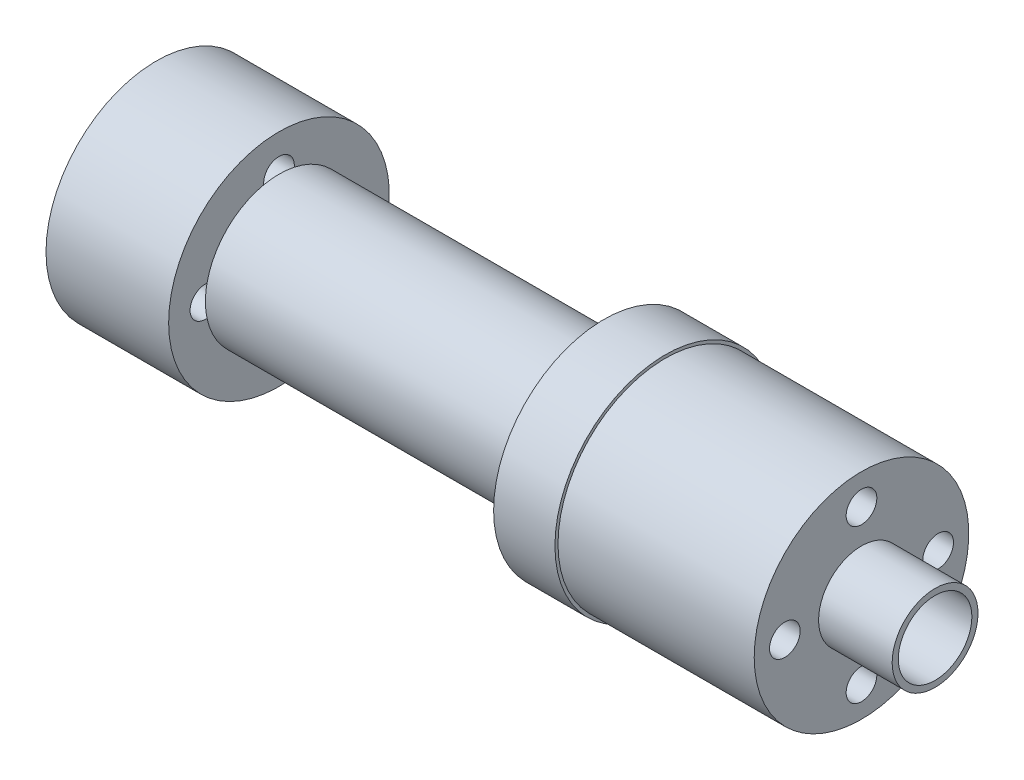
ISO-10303-21;
HEADER;
FILE_DESCRIPTION(('STEP AP214'),'2;1');
FILE_NAME('part.step','',(''),(''),'','','');
FILE_SCHEMA(('AUTOMOTIVE_DESIGN { 1 0 10303 214 1 1 1 1 }'));
ENDSEC;
DATA;
#1=APPLICATION_CONTEXT('core data for automotive mechanical design processes');
#2=APPLICATION_PROTOCOL_DEFINITION('international standard','automotive_design',2000,#1);
#3=PRODUCT_CONTEXT('',#1,'mechanical');
#4=PRODUCT('Part','Part','',(#3));
#5=PRODUCT_RELATED_PRODUCT_CATEGORY('part','',(#4));
#6=PRODUCT_DEFINITION_FORMATION('','',#4);
#7=PRODUCT_DEFINITION_CONTEXT('part definition',#1,'design');
#8=PRODUCT_DEFINITION('design','',#6,#7);
#9=PRODUCT_DEFINITION_SHAPE('','',#8);
#10=(LENGTH_UNIT() NAMED_UNIT(*) SI_UNIT(.MILLI.,.METRE.));
#11=(NAMED_UNIT(*) PLANE_ANGLE_UNIT() SI_UNIT($,.RADIAN.));
#12=(NAMED_UNIT(*) SI_UNIT($,.STERADIAN.) SOLID_ANGLE_UNIT());
#13=UNCERTAINTY_MEASURE_WITH_UNIT(LENGTH_MEASURE(1.E-05),#10,'distance_accuracy_value','');
#14=(GEOMETRIC_REPRESENTATION_CONTEXT(3) GLOBAL_UNCERTAINTY_ASSIGNED_CONTEXT((#13)) GLOBAL_UNIT_ASSIGNED_CONTEXT((#10,
#11,#12)) REPRESENTATION_CONTEXT('',''));
#15=CARTESIAN_POINT('',(0.,0.,0.));
#16=DIRECTION('',(0.,0.,1.));
#17=DIRECTION('',(1.,0.,0.));
#18=AXIS2_PLACEMENT_3D('',#15,#16,#17);
#19=CARTESIAN_POINT('',(57.5,3.,0.));
#20=DIRECTION('',(-1.,0.,0.));
#21=DIRECTION('',(0.,0.,1.));
#22=AXIS2_PLACEMENT_3D('',#19,#20,#21);
#23=PLANE('',#22);
#24=CARTESIAN_POINT('',(57.5,0.,0.));
#25=DIRECTION('',(-1.,0.,0.));
#26=DIRECTION('',(0.,0.,1.));
#27=AXIS2_PLACEMENT_3D('',#24,#25,#26);
#28=CIRCLE('',#27,8.75);
#29=CARTESIAN_POINT('',(57.5,0.,8.75));
#30=VERTEX_POINT('',#29);
#31=EDGE_CURVE('E172',#30,#30,#28,.T.);
#32=ORIENTED_EDGE('',*,*,#31,.F.);
#33=EDGE_LOOP('',(#32));
#34=FACE_BOUND('',#33,.T.);
#35=CARTESIAN_POINT('',(57.5,0.,6.25));
#36=DIRECTION('',(1.,0.,0.));
#37=DIRECTION('',(0.,0.,-1.));
#38=AXIS2_PLACEMENT_3D('',#35,#36,#37);
#39=CIRCLE('',#38,1.24999999999999);
#40=CARTESIAN_POINT('',(57.5,0.,5.00000000000001));
#41=VERTEX_POINT('',#40);
#42=EDGE_CURVE('E122',#41,#41,#39,.T.);
#43=ORIENTED_EDGE('',*,*,#42,.F.);
#44=EDGE_LOOP('',(#43));
#45=FACE_BOUND('',#44,.T.);
#46=CARTESIAN_POINT('',(57.5,-6.25,0.));
#47=DIRECTION('',(1.,0.,0.));
#48=DIRECTION('',(0.,0.,-1.));
#49=AXIS2_PLACEMENT_3D('',#46,#47,#48);
#50=CIRCLE('',#49,1.24999999999999);
#51=CARTESIAN_POINT('',(57.5,-6.25,-1.24999999999999));
#52=VERTEX_POINT('',#51);
#53=EDGE_CURVE('E116',#52,#52,#50,.T.);
#54=ORIENTED_EDGE('',*,*,#53,.F.);
#55=EDGE_LOOP('',(#54));
#56=FACE_BOUND('',#55,.T.);
#57=CARTESIAN_POINT('',(57.5,0.,-6.25));
#58=DIRECTION('',(1.,0.,0.));
#59=DIRECTION('',(0.,0.,-1.));
#60=AXIS2_PLACEMENT_3D('',#57,#58,#59);
#61=CIRCLE('',#60,1.24999999999999);
#62=CARTESIAN_POINT('',(57.5,0.,-7.49999999999999));
#63=VERTEX_POINT('',#62);
#64=EDGE_CURVE('E103',#63,#63,#61,.T.);
#65=ORIENTED_EDGE('',*,*,#64,.F.);
#66=EDGE_LOOP('',(#65));
#67=FACE_BOUND('',#66,.T.);
#68=CARTESIAN_POINT('',(57.5,6.25,0.));
#69=DIRECTION('',(1.,0.,0.));
#70=DIRECTION('',(0.,0.,-1.));
#71=AXIS2_PLACEMENT_3D('',#68,#69,#70);
#72=CIRCLE('',#71,1.24999999999999);
#73=CARTESIAN_POINT('',(57.5,6.25,-1.24999999999999));
#74=VERTEX_POINT('',#73);
#75=EDGE_CURVE('E104',#74,#74,#72,.T.);
#76=ORIENTED_EDGE('',*,*,#75,.F.);
#77=EDGE_LOOP('',(#76));
#78=FACE_BOUND('',#77,.T.);
#79=CARTESIAN_POINT('',(57.5,0.,0.));
#80=DIRECTION('',(-1.,0.,0.));
#81=DIRECTION('',(0.,0.,1.));
#82=AXIS2_PLACEMENT_3D('',#79,#80,#81);
#83=CIRCLE('',#82,3.5);
#84=CARTESIAN_POINT('',(57.5,0.,3.5));
#85=VERTEX_POINT('',#84);
#86=EDGE_CURVE('E11',#85,#85,#83,.F.);
#87=ORIENTED_EDGE('',*,*,#86,.F.);
#88=EDGE_LOOP('',(#87));
#89=FACE_BOUND('',#88,.T.);
#90=ADVANCED_FACE('F42',(#34,#45,#56,#67,#78,#89),#23,.F.);
#91=CARTESIAN_POINT('',(0.,9.,0.));
#92=DIRECTION('',(1.,0.,0.));
#93=DIRECTION('',(0.,0.,-1.));
#94=AXIS2_PLACEMENT_3D('',#91,#92,#93);
#95=PLANE('',#94);
#96=CARTESIAN_POINT('',(0.,6.,0.));
#97=DIRECTION('',(-1.,0.,0.));
#98=DIRECTION('',(0.,0.,1.));
#99=AXIS2_PLACEMENT_3D('',#96,#97,#98);
#100=CIRCLE('',#99,1.24999999999999);
#101=CARTESIAN_POINT('',(0.,6.,1.24999999999999));
#102=VERTEX_POINT('',#101);
#103=EDGE_CURVE('E128',#102,#102,#100,.T.);
#104=ORIENTED_EDGE('',*,*,#103,.F.);
#105=EDGE_LOOP('',(#104));
#106=FACE_BOUND('',#105,.T.);
#107=CARTESIAN_POINT('',(0.,0.,6.));
#108=DIRECTION('',(-1.,0.,0.));
#109=DIRECTION('',(0.,0.,1.));
#110=AXIS2_PLACEMENT_3D('',#107,#108,#109);
#111=CIRCLE('',#110,1.24999999999999);
#112=CARTESIAN_POINT('',(0.,0.,7.24999999999999));
#113=VERTEX_POINT('',#112);
#114=EDGE_CURVE('E132',#113,#113,#111,.T.);
#115=ORIENTED_EDGE('',*,*,#114,.F.);
#116=EDGE_LOOP('',(#115));
#117=FACE_BOUND('',#116,.T.);
#118=CARTESIAN_POINT('',(0.,0.,-6.));
#119=DIRECTION('',(-1.,0.,0.));
#120=DIRECTION('',(0.,0.,1.));
#121=AXIS2_PLACEMENT_3D('',#118,#119,#120);
#122=CIRCLE('',#121,1.24999999999999);
#123=CARTESIAN_POINT('',(0.,0.,-4.75000000000001));
#124=VERTEX_POINT('',#123);
#125=EDGE_CURVE('E141',#124,#124,#122,.T.);
#126=ORIENTED_EDGE('',*,*,#125,.F.);
#127=EDGE_LOOP('',(#126));
#128=FACE_BOUND('',#127,.T.);
#129=CARTESIAN_POINT('',(0.,0.,0.));
#130=DIRECTION('',(-1.,0.,0.));
#131=DIRECTION('',(0.,0.,1.));
#132=AXIS2_PLACEMENT_3D('',#129,#130,#131);
#133=CIRCLE('',#132,3.);
#134=CARTESIAN_POINT('',(0.,0.,3.));
#135=VERTEX_POINT('',#134);
#136=EDGE_CURVE('E146',#135,#135,#133,.T.);
#137=ORIENTED_EDGE('',*,*,#136,.F.);
#138=EDGE_LOOP('',(#137));
#139=FACE_BOUND('',#138,.T.);
#140=CARTESIAN_POINT('',(0.,0.,0.));
#141=DIRECTION('',(-1.,0.,0.));
#142=DIRECTION('',(0.,0.,1.));
#143=AXIS2_PLACEMENT_3D('',#140,#141,#142);
#144=CIRCLE('',#143,9.);
#145=CARTESIAN_POINT('',(0.,0.,9.));
#146=VERTEX_POINT('',#145);
#147=EDGE_CURVE('E149',#146,#146,#144,.T.);
#148=ORIENTED_EDGE('',*,*,#147,.T.);
#149=EDGE_LOOP('',(#148));
#150=FACE_BOUND('',#149,.T.);
#151=CARTESIAN_POINT('',(0.,-6.,0.));
#152=DIRECTION('',(-1.,0.,0.));
#153=DIRECTION('',(0.,0.,1.));
#154=AXIS2_PLACEMENT_3D('',#151,#152,#153);
#155=CIRCLE('',#154,1.24999999999999);
#156=CARTESIAN_POINT('',(0.,-6.,1.24999999999999));
#157=VERTEX_POINT('',#156);
#158=EDGE_CURVE('E136',#157,#157,#155,.T.);
#159=ORIENTED_EDGE('',*,*,#158,.F.);
#160=EDGE_LOOP('',(#159));
#161=FACE_BOUND('',#160,.T.);
#162=ADVANCED_FACE('F230',(#106,#117,#128,#139,#150,#161),#95,.F.);
#163=CARTESIAN_POINT('',(0.,0.,0.));
#164=DIRECTION('',(-1.,0.,0.));
#165=DIRECTION('',(0.,0.,1.));
#166=AXIS2_PLACEMENT_3D('',#163,#164,#165);
#167=CYLINDRICAL_SURFACE('',#166,3.);
#168=ORIENTED_EDGE('',*,*,#136,.T.);
#169=EDGE_LOOP('',(#168));
#170=FACE_BOUND('',#169,.T.);
#171=CARTESIAN_POINT('',(63.5,0.,0.));
#172=DIRECTION('',(1.,0.,0.));
#173=DIRECTION('',(0.,0.,-1.));
#174=AXIS2_PLACEMENT_3D('',#171,#172,#173);
#175=CIRCLE('',#174,3.);
#176=CARTESIAN_POINT('',(63.5,0.,-3.));
#177=VERTEX_POINT('',#176);
#178=EDGE_CURVE('E576',#177,#177,#175,.T.);
#179=ORIENTED_EDGE('',*,*,#178,.T.);
#180=EDGE_LOOP('',(#179));
#181=FACE_BOUND('',#180,.T.);
#182=ADVANCED_FACE('F44',(#170,#181),#167,.F.);
#183=CARTESIAN_POINT('',(0.,0.,0.));
#184=DIRECTION('',(-1.,0.,0.));
#185=DIRECTION('',(0.,0.,1.));
#186=AXIS2_PLACEMENT_3D('',#183,#184,#185);
#187=CYLINDRICAL_SURFACE('',#186,8.75);
#188=CARTESIAN_POINT('',(41.5,0.,0.));
#189=DIRECTION('',(-1.,0.,0.));
#190=DIRECTION('',(0.,0.,1.));
#191=AXIS2_PLACEMENT_3D('',#188,#189,#190);
#192=CIRCLE('',#191,8.75);
#193=CARTESIAN_POINT('',(41.5,0.,8.75));
#194=VERTEX_POINT('',#193);
#195=EDGE_CURVE('E169',#194,#194,#192,.T.);
#196=ORIENTED_EDGE('',*,*,#195,.F.);
#197=EDGE_LOOP('',(#196));
#198=FACE_BOUND('',#197,.T.);
#199=ORIENTED_EDGE('',*,*,#31,.T.);
#200=EDGE_LOOP('',(#199));
#201=FACE_BOUND('',#200,.T.);
#202=ADVANCED_FACE('F240',(#198,#201),#187,.T.);
#203=CARTESIAN_POINT('',(41.5,8.75,0.));
#204=DIRECTION('',(-1.,0.,0.));
#205=DIRECTION('',(0.,0.,1.));
#206=AXIS2_PLACEMENT_3D('',#203,#204,#205);
#207=PLANE('',#206);
#208=CARTESIAN_POINT('',(41.5,0.,0.));
#209=DIRECTION('',(-1.,0.,0.));
#210=DIRECTION('',(0.,0.,1.));
#211=AXIS2_PLACEMENT_3D('',#208,#209,#210);
#212=CIRCLE('',#211,9.);
#213=CARTESIAN_POINT('',(41.5,0.,9.));
#214=VERTEX_POINT('',#213);
#215=EDGE_CURVE('E166',#214,#214,#212,.T.);
#216=ORIENTED_EDGE('',*,*,#215,.F.);
#217=EDGE_LOOP('',(#216));
#218=FACE_BOUND('',#217,.T.);
#219=ORIENTED_EDGE('',*,*,#195,.T.);
#220=EDGE_LOOP('',(#219));
#221=FACE_BOUND('',#220,.T.);
#222=ADVANCED_FACE('F243',(#218,#221),#207,.F.);
#223=CARTESIAN_POINT('',(0.,0.,0.));
#224=DIRECTION('',(-1.,0.,0.));
#225=DIRECTION('',(0.,0.,1.));
#226=AXIS2_PLACEMENT_3D('',#223,#224,#225);
#227=CYLINDRICAL_SURFACE('',#226,9.);
#228=CARTESIAN_POINT('',(36.5,0.,0.));
#229=DIRECTION('',(-1.,0.,0.));
#230=DIRECTION('',(0.,0.,1.));
#231=AXIS2_PLACEMENT_3D('',#228,#229,#230);
#232=CIRCLE('',#231,9.);
#233=CARTESIAN_POINT('',(36.5,0.,9.));
#234=VERTEX_POINT('',#233);
#235=EDGE_CURVE('E163',#234,#234,#232,.T.);
#236=ORIENTED_EDGE('',*,*,#235,.F.);
#237=EDGE_LOOP('',(#236));
#238=FACE_BOUND('',#237,.T.);
#239=ORIENTED_EDGE('',*,*,#215,.T.);
#240=EDGE_LOOP('',(#239));
#241=FACE_BOUND('',#240,.T.);
#242=ADVANCED_FACE('F247',(#238,#241),#227,.T.);
#243=CARTESIAN_POINT('',(36.5,6.,0.));
#244=DIRECTION('',(1.,0.,0.));
#245=DIRECTION('',(0.,0.,-1.));
#246=AXIS2_PLACEMENT_3D('',#243,#244,#245);
#247=PLANE('',#246);
#248=CARTESIAN_POINT('',(36.5,0.,0.));
#249=DIRECTION('',(-1.,0.,0.));
#250=DIRECTION('',(0.,0.,1.));
#251=AXIS2_PLACEMENT_3D('',#248,#249,#250);
#252=CIRCLE('',#251,6.);
#253=CARTESIAN_POINT('',(36.5,0.,6.));
#254=VERTEX_POINT('',#253);
#255=EDGE_CURVE('E159',#254,#254,#252,.T.);
#256=ORIENTED_EDGE('',*,*,#255,.F.);
#257=EDGE_LOOP('',(#256));
#258=FACE_BOUND('',#257,.T.);
#259=ORIENTED_EDGE('',*,*,#235,.T.);
#260=EDGE_LOOP('',(#259));
#261=FACE_BOUND('',#260,.T.);
#262=ADVANCED_FACE('F251',(#258,#261),#247,.F.);
#263=CARTESIAN_POINT('',(0.,0.,0.));
#264=DIRECTION('',(-1.,0.,0.));
#265=DIRECTION('',(0.,0.,1.));
#266=AXIS2_PLACEMENT_3D('',#263,#264,#265);
#267=CYLINDRICAL_SURFACE('',#266,6.);
#268=CARTESIAN_POINT('',(10.,0.,0.));
#269=DIRECTION('',(-1.,0.,0.));
#270=DIRECTION('',(0.,0.,1.));
#271=AXIS2_PLACEMENT_3D('',#268,#269,#270);
#272=CIRCLE('',#271,6.);
#273=CARTESIAN_POINT('',(10.,1.24319981898749,-5.86979166666667));
#274=VERTEX_POINT('',#273);
#275=CARTESIAN_POINT('',(10.,-1.24319981898749,-5.86979166666667));
#276=VERTEX_POINT('',#275);
#277=EDGE_CURVE('E156',#274,#276,#272,.T.);
#278=ORIENTED_EDGE('',*,*,#277,.F.);
#279=CARTESIAN_POINT('',(10.,5.86979166666667,-1.24319981898749));
#280=VERTEX_POINT('',#279);
#281=EDGE_CURVE('E155',#280,#274,#272,.T.);
#282=ORIENTED_EDGE('',*,*,#281,.F.);
#283=CARTESIAN_POINT('',(10.,5.86979166666667,1.24319981898749));
#284=VERTEX_POINT('',#283);
#285=EDGE_CURVE('E196',#284,#280,#272,.T.);
#286=ORIENTED_EDGE('',*,*,#285,.F.);
#287=CARTESIAN_POINT('',(10.,1.24319981898749,5.86979166666667));
#288=VERTEX_POINT('',#287);
#289=EDGE_CURVE('E190',#288,#284,#272,.T.);
#290=ORIENTED_EDGE('',*,*,#289,.F.);
#291=CARTESIAN_POINT('',(10.,-1.24319981898749,5.86979166666667));
#292=VERTEX_POINT('',#291);
#293=EDGE_CURVE('E199',#292,#288,#272,.T.);
#294=ORIENTED_EDGE('',*,*,#293,.F.);
#295=CARTESIAN_POINT('',(10.,-5.86979166666667,1.24319981898749));
#296=VERTEX_POINT('',#295);
#297=EDGE_CURVE('E200',#296,#292,#272,.T.);
#298=ORIENTED_EDGE('',*,*,#297,.F.);
#299=CARTESIAN_POINT('',(10.,-5.86979166666667,-1.24319981898749));
#300=VERTEX_POINT('',#299);
#301=EDGE_CURVE('E204',#300,#296,#272,.T.);
#302=ORIENTED_EDGE('',*,*,#301,.F.);
#303=EDGE_CURVE('E160',#276,#300,#272,.T.);
#304=ORIENTED_EDGE('',*,*,#303,.F.);
#305=EDGE_LOOP('',(#278,#282,#286,#290,#294,#298,#302,#304));
#306=FACE_BOUND('',#305,.T.);
#307=ORIENTED_EDGE('',*,*,#255,.T.);
#308=EDGE_LOOP('',(#307));
#309=FACE_BOUND('',#308,.T.);
#310=ADVANCED_FACE('F194',(#306,#309),#267,.T.);
#311=CARTESIAN_POINT('',(10.,9.,0.));
#312=DIRECTION('',(-1.,0.,0.));
#313=DIRECTION('',(0.,0.,1.));
#314=AXIS2_PLACEMENT_3D('',#311,#312,#313);
#315=PLANE('',#314);
#316=CARTESIAN_POINT('',(10.,0.,0.));
#317=DIRECTION('',(-1.,0.,0.));
#318=DIRECTION('',(0.,0.,1.));
#319=AXIS2_PLACEMENT_3D('',#316,#317,#318);
#320=CIRCLE('',#319,9.);
#321=CARTESIAN_POINT('',(10.,0.,9.));
#322=VERTEX_POINT('',#321);
#323=EDGE_CURVE('E152',#322,#322,#320,.T.);
#324=ORIENTED_EDGE('',*,*,#323,.F.);
#325=EDGE_LOOP('',(#324));
#326=FACE_BOUND('',#325,.T.);
#327=ORIENTED_EDGE('',*,*,#289,.T.);
#328=CARTESIAN_POINT('',(10.,6.,0.));
#329=DIRECTION('',(-1.,0.,0.));
#330=DIRECTION('',(0.,0.,1.));
#331=AXIS2_PLACEMENT_3D('',#328,#329,#330);
#332=CIRCLE('',#331,1.24999999999999);
#333=EDGE_CURVE('E50',#284,#280,#332,.T.);
#334=ORIENTED_EDGE('',*,*,#333,.T.);
#335=ORIENTED_EDGE('',*,*,#281,.T.);
#336=CARTESIAN_POINT('',(10.,0.,-6.));
#337=DIRECTION('',(-1.,0.,0.));
#338=DIRECTION('',(0.,0.,1.));
#339=AXIS2_PLACEMENT_3D('',#336,#337,#338);
#340=CIRCLE('',#339,1.24999999999999);
#341=EDGE_CURVE('E175',#274,#276,#340,.T.);
#342=ORIENTED_EDGE('',*,*,#341,.T.);
#343=ORIENTED_EDGE('',*,*,#303,.T.);
#344=CARTESIAN_POINT('',(10.,-6.,0.));
#345=DIRECTION('',(-1.,0.,0.));
#346=DIRECTION('',(0.,0.,1.));
#347=AXIS2_PLACEMENT_3D('',#344,#345,#346);
#348=CIRCLE('',#347,1.24999999999999);
#349=EDGE_CURVE('E178',#300,#296,#348,.T.);
#350=ORIENTED_EDGE('',*,*,#349,.T.);
#351=ORIENTED_EDGE('',*,*,#297,.T.);
#352=CARTESIAN_POINT('',(10.,0.,6.));
#353=DIRECTION('',(-1.,0.,0.));
#354=DIRECTION('',(0.,0.,1.));
#355=AXIS2_PLACEMENT_3D('',#352,#353,#354);
#356=CIRCLE('',#355,1.24999999999999);
#357=EDGE_CURVE('E181',#292,#288,#356,.T.);
#358=ORIENTED_EDGE('',*,*,#357,.T.);
#359=EDGE_LOOP('',(#327,#334,#335,#342,#343,#350,#351,#358));
#360=FACE_BOUND('',#359,.T.);
#361=ADVANCED_FACE('F187',(#326,#360),#315,.F.);
#362=CARTESIAN_POINT('',(0.,0.,0.));
#363=DIRECTION('',(-1.,0.,0.));
#364=DIRECTION('',(0.,0.,1.));
#365=AXIS2_PLACEMENT_3D('',#362,#363,#364);
#366=CYLINDRICAL_SURFACE('',#365,9.);
#367=ORIENTED_EDGE('',*,*,#147,.F.);
#368=EDGE_LOOP('',(#367));
#369=FACE_BOUND('',#368,.T.);
#370=ORIENTED_EDGE('',*,*,#323,.T.);
#371=EDGE_LOOP('',(#370));
#372=FACE_BOUND('',#371,.T.);
#373=ADVANCED_FACE('F218',(#369,#372),#366,.T.);
#374=CARTESIAN_POINT('',(10.,9.,0.));
#375=DIRECTION('',(-1.,0.,0.));
#376=DIRECTION('',(0.,0.,1.));
#377=AXIS2_PLACEMENT_3D('',#374,#375,#376);
#378=PLANE('',#377);
#379=ORIENTED_EDGE('',*,*,#277,.T.);
#380=CARTESIAN_POINT('',(10.,0.,-6.));
#381=DIRECTION('',(-1.,0.,0.));
#382=DIRECTION('',(0.,0.,1.));
#383=AXIS2_PLACEMENT_3D('',#380,#381,#382);
#384=CIRCLE('',#383,1.24999999999999);
#385=EDGE_CURVE('E144',#274,#276,#384,.F.);
#386=ORIENTED_EDGE('',*,*,#385,.F.);
#387=EDGE_LOOP('',(#379,#386));
#388=FACE_BOUND('',#387,.T.);
#389=ADVANCED_FACE('F216',(#388),#378,.T.);
#390=CARTESIAN_POINT('',(0.,0.,-6.));
#391=DIRECTION('',(-1.,0.,0.));
#392=DIRECTION('',(0.,0.,1.));
#393=AXIS2_PLACEMENT_3D('',#390,#391,#392);
#394=CYLINDRICAL_SURFACE('',#393,1.24999999999999);
#395=ORIENTED_EDGE('',*,*,#385,.T.);
#396=ORIENTED_EDGE('',*,*,#341,.F.);
#397=EDGE_LOOP('',(#395,#396));
#398=FACE_BOUND('',#397,.T.);
#399=ORIENTED_EDGE('',*,*,#125,.T.);
#400=EDGE_LOOP('',(#399));
#401=FACE_BOUND('',#400,.T.);
#402=ADVANCED_FACE('F213',(#398,#401),#394,.F.);
#403=CARTESIAN_POINT('',(10.,9.,0.));
#404=DIRECTION('',(-1.,0.,0.));
#405=DIRECTION('',(0.,0.,1.));
#406=AXIS2_PLACEMENT_3D('',#403,#404,#405);
#407=PLANE('',#406);
#408=ORIENTED_EDGE('',*,*,#301,.T.);
#409=CARTESIAN_POINT('',(10.,-6.,0.));
#410=DIRECTION('',(-1.,0.,0.));
#411=DIRECTION('',(0.,0.,1.));
#412=AXIS2_PLACEMENT_3D('',#409,#410,#411);
#413=CIRCLE('',#412,1.24999999999999);
#414=EDGE_CURVE('E139',#300,#296,#413,.F.);
#415=ORIENTED_EDGE('',*,*,#414,.F.);
#416=EDGE_LOOP('',(#408,#415));
#417=FACE_BOUND('',#416,.T.);
#418=ADVANCED_FACE('F224',(#417),#407,.T.);
#419=CARTESIAN_POINT('',(0.,-6.,0.));
#420=DIRECTION('',(-1.,0.,0.));
#421=DIRECTION('',(0.,0.,1.));
#422=AXIS2_PLACEMENT_3D('',#419,#420,#421);
#423=CYLINDRICAL_SURFACE('',#422,1.24999999999999);
#424=ORIENTED_EDGE('',*,*,#414,.T.);
#425=ORIENTED_EDGE('',*,*,#349,.F.);
#426=EDGE_LOOP('',(#424,#425));
#427=FACE_BOUND('',#426,.T.);
#428=ORIENTED_EDGE('',*,*,#158,.T.);
#429=EDGE_LOOP('',(#428));
#430=FACE_BOUND('',#429,.T.);
#431=ADVANCED_FACE('F438',(#427,#430),#423,.F.);
#432=CARTESIAN_POINT('',(10.,9.,0.));
#433=DIRECTION('',(-1.,0.,0.));
#434=DIRECTION('',(0.,0.,1.));
#435=AXIS2_PLACEMENT_3D('',#432,#433,#434);
#436=PLANE('',#435);
#437=ORIENTED_EDGE('',*,*,#293,.T.);
#438=CARTESIAN_POINT('',(10.,0.,6.));
#439=DIRECTION('',(-1.,0.,0.));
#440=DIRECTION('',(0.,0.,1.));
#441=AXIS2_PLACEMENT_3D('',#438,#439,#440);
#442=CIRCLE('',#441,1.24999999999999);
#443=EDGE_CURVE('E63',#292,#288,#442,.F.);
#444=ORIENTED_EDGE('',*,*,#443,.F.);
#445=EDGE_LOOP('',(#437,#444));
#446=FACE_BOUND('',#445,.T.);
#447=ADVANCED_FACE('F430',(#446),#436,.T.);
#448=CARTESIAN_POINT('',(0.,0.,6.));
#449=DIRECTION('',(-1.,0.,0.));
#450=DIRECTION('',(0.,0.,1.));
#451=AXIS2_PLACEMENT_3D('',#448,#449,#450);
#452=CYLINDRICAL_SURFACE('',#451,1.24999999999999);
#453=ORIENTED_EDGE('',*,*,#443,.T.);
#454=ORIENTED_EDGE('',*,*,#357,.F.);
#455=EDGE_LOOP('',(#453,#454));
#456=FACE_BOUND('',#455,.T.);
#457=ORIENTED_EDGE('',*,*,#114,.T.);
#458=EDGE_LOOP('',(#457));
#459=FACE_BOUND('',#458,.T.);
#460=ADVANCED_FACE('F423',(#456,#459),#452,.F.);
#461=CARTESIAN_POINT('',(10.,9.,0.));
#462=DIRECTION('',(-1.,0.,0.));
#463=DIRECTION('',(0.,0.,1.));
#464=AXIS2_PLACEMENT_3D('',#461,#462,#463);
#465=PLANE('',#464);
#466=ORIENTED_EDGE('',*,*,#285,.T.);
#467=CARTESIAN_POINT('',(10.,6.,0.));
#468=DIRECTION('',(-1.,0.,0.));
#469=DIRECTION('',(0.,0.,1.));
#470=AXIS2_PLACEMENT_3D('',#467,#468,#469);
#471=CIRCLE('',#470,1.24999999999999);
#472=EDGE_CURVE('E56',#284,#280,#471,.F.);
#473=ORIENTED_EDGE('',*,*,#472,.F.);
#474=EDGE_LOOP('',(#466,#473));
#475=FACE_BOUND('',#474,.T.);
#476=ADVANCED_FACE('F414',(#475),#465,.T.);
#477=CARTESIAN_POINT('',(0.,6.,0.));
#478=DIRECTION('',(-1.,0.,0.));
#479=DIRECTION('',(0.,0.,1.));
#480=AXIS2_PLACEMENT_3D('',#477,#478,#479);
#481=CYLINDRICAL_SURFACE('',#480,1.24999999999999);
#482=ORIENTED_EDGE('',*,*,#472,.T.);
#483=ORIENTED_EDGE('',*,*,#333,.F.);
#484=EDGE_LOOP('',(#482,#483));
#485=FACE_BOUND('',#484,.T.);
#486=ORIENTED_EDGE('',*,*,#103,.T.);
#487=EDGE_LOOP('',(#486));
#488=FACE_BOUND('',#487,.T.);
#489=ADVANCED_FACE('F405',(#485,#488),#481,.F.);
#490=CARTESIAN_POINT('',(48.,0.,6.25));
#491=DIRECTION('',(1.,0.,0.));
#492=DIRECTION('',(0.,0.,-1.));
#493=AXIS2_PLACEMENT_3D('',#490,#491,#492);
#494=CONICAL_SURFACE('',#493,1.24999999999999,1.02974425867665);
#495=CARTESIAN_POINT('',(47.2489242262156,0.,6.25));
#496=VERTEX_POINT('',#495);
#497=VERTEX_LOOP('',#496);
#498=FACE_BOUND('',#497,.T.);
#499=CARTESIAN_POINT('',(48.,0.,6.25));
#500=DIRECTION('',(1.,0.,0.));
#501=DIRECTION('',(0.,0.,-1.));
#502=AXIS2_PLACEMENT_3D('',#499,#500,#501);
#503=CIRCLE('',#502,1.24999999999999);
#504=CARTESIAN_POINT('',(48.,0.,5.00000000000002));
#505=VERTEX_POINT('',#504);
#506=EDGE_CURVE('E125',#505,#505,#503,.T.);
#507=ORIENTED_EDGE('',*,*,#506,.T.);
#508=EDGE_LOOP('',(#507));
#509=FACE_BOUND('',#508,.T.);
#510=ADVANCED_FACE('F397',(#498,#509),#494,.F.);
#511=CARTESIAN_POINT('',(57.5,0.,6.25));
#512=DIRECTION('',(1.,0.,0.));
#513=DIRECTION('',(0.,0.,-1.));
#514=AXIS2_PLACEMENT_3D('',#511,#512,#513);
#515=CYLINDRICAL_SURFACE('',#514,1.24999999999999);
#516=ORIENTED_EDGE('',*,*,#506,.F.);
#517=EDGE_LOOP('',(#516));
#518=FACE_BOUND('',#517,.T.);
#519=ORIENTED_EDGE('',*,*,#42,.T.);
#520=EDGE_LOOP('',(#519));
#521=FACE_BOUND('',#520,.T.);
#522=ADVANCED_FACE('F389',(#518,#521),#515,.F.);
#523=CARTESIAN_POINT('',(48.,-6.25,0.));
#524=DIRECTION('',(1.,0.,0.));
#525=DIRECTION('',(0.,0.,-1.));
#526=AXIS2_PLACEMENT_3D('',#523,#524,#525);
#527=CONICAL_SURFACE('',#526,1.24999999999999,1.02974425867665);
#528=CARTESIAN_POINT('',(47.2489242262156,-6.25000000000001,0.));
#529=VERTEX_POINT('',#528);
#530=VERTEX_LOOP('',#529);
#531=FACE_BOUND('',#530,.T.);
#532=CARTESIAN_POINT('',(48.,-6.25,0.));
#533=DIRECTION('',(1.,0.,0.));
#534=DIRECTION('',(0.,0.,-1.));
#535=AXIS2_PLACEMENT_3D('',#532,#533,#534);
#536=CIRCLE('',#535,1.24999999999999);
#537=CARTESIAN_POINT('',(48.,-6.25,-1.24999999999999));
#538=VERTEX_POINT('',#537);
#539=EDGE_CURVE('E119',#538,#538,#536,.T.);
#540=ORIENTED_EDGE('',*,*,#539,.T.);
#541=EDGE_LOOP('',(#540));
#542=FACE_BOUND('',#541,.T.);
#543=ADVANCED_FACE('F380',(#531,#542),#527,.F.);
#544=CARTESIAN_POINT('',(57.5,-6.25,0.));
#545=DIRECTION('',(1.,0.,0.));
#546=DIRECTION('',(0.,0.,-1.));
#547=AXIS2_PLACEMENT_3D('',#544,#545,#546);
#548=CYLINDRICAL_SURFACE('',#547,1.24999999999999);
#549=ORIENTED_EDGE('',*,*,#539,.F.);
#550=EDGE_LOOP('',(#549));
#551=FACE_BOUND('',#550,.T.);
#552=ORIENTED_EDGE('',*,*,#53,.T.);
#553=EDGE_LOOP('',(#552));
#554=FACE_BOUND('',#553,.T.);
#555=ADVANCED_FACE('F372',(#551,#554),#548,.F.);
#556=CARTESIAN_POINT('',(48.,0.,-6.25));
#557=DIRECTION('',(1.,0.,0.));
#558=DIRECTION('',(0.,0.,-1.));
#559=AXIS2_PLACEMENT_3D('',#556,#557,#558);
#560=CONICAL_SURFACE('',#559,1.24999999999999,1.02974425867665);
#561=CARTESIAN_POINT('',(47.2489242262156,0.,-6.25));
#562=VERTEX_POINT('',#561);
#563=VERTEX_LOOP('',#562);
#564=FACE_BOUND('',#563,.T.);
#565=CARTESIAN_POINT('',(48.,0.,-6.25));
#566=DIRECTION('',(1.,0.,0.));
#567=DIRECTION('',(0.,0.,-1.));
#568=AXIS2_PLACEMENT_3D('',#565,#566,#567);
#569=CIRCLE('',#568,1.24999999999999);
#570=CARTESIAN_POINT('',(48.,0.,-7.49999999999999));
#571=VERTEX_POINT('',#570);
#572=EDGE_CURVE('E107',#571,#571,#569,.T.);
#573=ORIENTED_EDGE('',*,*,#572,.T.);
#574=EDGE_LOOP('',(#573));
#575=FACE_BOUND('',#574,.T.);
#576=ADVANCED_FACE('F363',(#564,#575),#560,.F.);
#577=CARTESIAN_POINT('',(57.5,0.,-6.25));
#578=DIRECTION('',(1.,0.,0.));
#579=DIRECTION('',(0.,0.,-1.));
#580=AXIS2_PLACEMENT_3D('',#577,#578,#579);
#581=CYLINDRICAL_SURFACE('',#580,1.24999999999999);
#582=ORIENTED_EDGE('',*,*,#572,.F.);
#583=EDGE_LOOP('',(#582));
#584=FACE_BOUND('',#583,.T.);
#585=ORIENTED_EDGE('',*,*,#64,.T.);
#586=EDGE_LOOP('',(#585));
#587=FACE_BOUND('',#586,.T.);
#588=ADVANCED_FACE('F97',(#584,#587),#581,.F.);
#589=CARTESIAN_POINT('',(48.,6.25,0.));
#590=DIRECTION('',(1.,0.,0.));
#591=DIRECTION('',(0.,0.,-1.));
#592=AXIS2_PLACEMENT_3D('',#589,#590,#591);
#593=CONICAL_SURFACE('',#592,1.24999999999999,1.02974425867665);
#594=CARTESIAN_POINT('',(47.2489242262156,6.25,0.));
#595=VERTEX_POINT('',#594);
#596=VERTEX_LOOP('',#595);
#597=FACE_BOUND('',#596,.T.);
#598=CARTESIAN_POINT('',(48.,6.25,0.));
#599=DIRECTION('',(1.,0.,0.));
#600=DIRECTION('',(0.,0.,-1.));
#601=AXIS2_PLACEMENT_3D('',#598,#599,#600);
#602=CIRCLE('',#601,1.24999999999999);
#603=CARTESIAN_POINT('',(48.,6.25,-1.24999999999999));
#604=VERTEX_POINT('',#603);
#605=EDGE_CURVE('E101',#604,#604,#602,.T.);
#606=ORIENTED_EDGE('',*,*,#605,.T.);
#607=EDGE_LOOP('',(#606));
#608=FACE_BOUND('',#607,.T.);
#609=ADVANCED_FACE('F93',(#597,#608),#593,.F.);
#610=CARTESIAN_POINT('',(57.5,6.25,0.));
#611=DIRECTION('',(1.,0.,0.));
#612=DIRECTION('',(0.,0.,-1.));
#613=AXIS2_PLACEMENT_3D('',#610,#611,#612);
#614=CYLINDRICAL_SURFACE('',#613,1.24999999999999);
#615=ORIENTED_EDGE('',*,*,#605,.F.);
#616=EDGE_LOOP('',(#615));
#617=FACE_BOUND('',#616,.T.);
#618=ORIENTED_EDGE('',*,*,#75,.T.);
#619=EDGE_LOOP('',(#618));
#620=FACE_BOUND('',#619,.T.);
#621=ADVANCED_FACE('F96',(#617,#620),#614,.F.);
#622=CARTESIAN_POINT('',(63.5,0.,0.));
#623=DIRECTION('',(1.,0.,0.));
#624=DIRECTION('',(0.,0.,-1.));
#625=AXIS2_PLACEMENT_3D('',#622,#623,#624);
#626=PLANE('',#625);
#627=CARTESIAN_POINT('',(63.5,0.,0.));
#628=DIRECTION('',(1.,0.,0.));
#629=DIRECTION('',(0.,0.,-1.));
#630=AXIS2_PLACEMENT_3D('',#627,#628,#629);
#631=CIRCLE('',#630,3.5);
#632=CARTESIAN_POINT('',(63.5,0.,-3.5));
#633=VERTEX_POINT('',#632);
#634=EDGE_CURVE('E110',#633,#633,#631,.T.);
#635=ORIENTED_EDGE('',*,*,#634,.T.);
#636=EDGE_LOOP('',(#635));
#637=FACE_BOUND('',#636,.T.);
#638=ORIENTED_EDGE('',*,*,#178,.F.);
#639=EDGE_LOOP('',(#638));
#640=FACE_BOUND('',#639,.T.);
#641=ADVANCED_FACE('F329',(#637,#640),#626,.T.);
#642=CARTESIAN_POINT('',(63.5,0.,0.));
#643=DIRECTION('',(-1.,0.,0.));
#644=DIRECTION('',(0.,0.,1.));
#645=AXIS2_PLACEMENT_3D('',#642,#643,#644);
#646=CYLINDRICAL_SURFACE('',#645,3.5);
#647=ORIENTED_EDGE('',*,*,#634,.F.);
#648=EDGE_LOOP('',(#647));
#649=FACE_BOUND('',#648,.T.);
#650=ORIENTED_EDGE('',*,*,#86,.T.);
#651=EDGE_LOOP('',(#650));
#652=FACE_BOUND('',#651,.T.);
#653=ADVANCED_FACE('F334',(#649,#652),#646,.T.);
#654=CLOSED_SHELL('',(#90,#162,#182,#202,#222,#242,#262,#310,#361,#373,#389,#402,#418,#431,#447,
#460,#476,#489,#510,#522,#543,#555,#576,#588,#609,#621,#641,#653));
#655=MANIFOLD_SOLID_BREP('B2',#654);
#656=ADVANCED_BREP_SHAPE_REPRESENTATION('',(#18,#655),#14);
#657=SHAPE_DEFINITION_REPRESENTATION(#9,#656);
ENDSEC;
END-ISO-10303-21;
